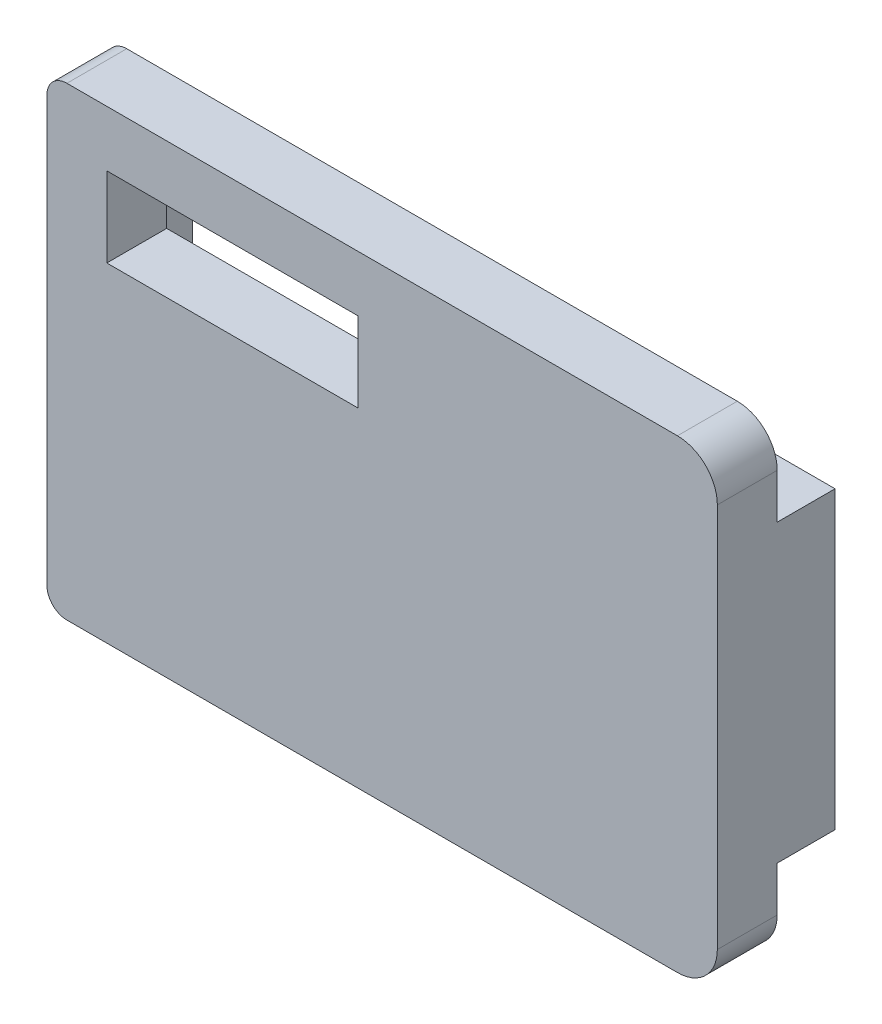
ISO-10303-21;
HEADER;
FILE_DESCRIPTION(('STEP AP214'),'2;1');
FILE_NAME('part.step','',(''),(''),'','','');
FILE_SCHEMA(('AUTOMOTIVE_DESIGN { 1 0 10303 214 1 1 1 1 }'));
ENDSEC;
DATA;
#1=APPLICATION_CONTEXT('core data for automotive mechanical design processes');
#2=APPLICATION_PROTOCOL_DEFINITION('international standard','automotive_design',2000,#1);
#3=PRODUCT_CONTEXT('',#1,'mechanical');
#4=PRODUCT('Part','Part','',(#3));
#5=PRODUCT_RELATED_PRODUCT_CATEGORY('part','',(#4));
#6=PRODUCT_DEFINITION_FORMATION('','',#4);
#7=PRODUCT_DEFINITION_CONTEXT('part definition',#1,'design');
#8=PRODUCT_DEFINITION('design','',#6,#7);
#9=PRODUCT_DEFINITION_SHAPE('','',#8);
#10=(LENGTH_UNIT() NAMED_UNIT(*) SI_UNIT(.MILLI.,.METRE.));
#11=(NAMED_UNIT(*) PLANE_ANGLE_UNIT() SI_UNIT($,.RADIAN.));
#12=(NAMED_UNIT(*) SI_UNIT($,.STERADIAN.) SOLID_ANGLE_UNIT());
#13=UNCERTAINTY_MEASURE_WITH_UNIT(LENGTH_MEASURE(1.E-05),#10,'distance_accuracy_value','');
#14=(GEOMETRIC_REPRESENTATION_CONTEXT(3) GLOBAL_UNCERTAINTY_ASSIGNED_CONTEXT((#13)) GLOBAL_UNIT_ASSIGNED_CONTEXT((#10,
#11,#12)) REPRESENTATION_CONTEXT('',''));
#15=CARTESIAN_POINT('',(0.,0.,0.));
#16=DIRECTION('',(0.,0.,1.));
#17=DIRECTION('',(1.,0.,0.));
#18=AXIS2_PLACEMENT_3D('',#15,#16,#17);
#19=CARTESIAN_POINT('',(24.3,0.,0.));
#20=DIRECTION('',(1.,0.,0.));
#21=DIRECTION('',(0.,0.,-1.));
#22=AXIS2_PLACEMENT_3D('',#19,#20,#21);
#23=PLANE('',#22);
#24=DIRECTION('',(0.,0.,-1.));
#25=VECTOR('',#24,1.);
#26=CARTESIAN_POINT('',(24.3,2.,-4.5));
#27=LINE('',#26,#25);
#28=CARTESIAN_POINT('',(24.3,2.,14.5));
#29=VERTEX_POINT('',#28);
#30=CARTESIAN_POINT('',(24.3,2.,11.5));
#31=VERTEX_POINT('',#30);
#32=EDGE_CURVE('E421',#29,#31,#27,.T.);
#33=ORIENTED_EDGE('',*,*,#32,.T.);
#34=DIRECTION('',(0.,1.,0.));
#35=VECTOR('',#34,1.);
#36=CARTESIAN_POINT('',(24.3,0.,11.5));
#37=LINE('',#36,#35);
#38=CARTESIAN_POINT('',(24.3,4.25,11.5));
#39=VERTEX_POINT('',#38);
#40=EDGE_CURVE('E344',#31,#39,#37,.T.);
#41=ORIENTED_EDGE('',*,*,#40,.T.);
#42=DIRECTION('',(0.,0.,1.));
#43=VECTOR('',#42,1.);
#44=CARTESIAN_POINT('',(24.3,4.25,8.6));
#45=LINE('',#44,#43);
#46=CARTESIAN_POINT('',(24.3,4.25,8.6));
#47=VERTEX_POINT('',#46);
#48=EDGE_CURVE('E324',#47,#39,#45,.T.);
#49=ORIENTED_EDGE('',*,*,#48,.F.);
#50=DIRECTION('',(0.,-1.,0.));
#51=VECTOR('',#50,1.);
#52=CARTESIAN_POINT('',(24.3,0.,8.6));
#53=LINE('',#52,#51);
#54=CARTESIAN_POINT('',(24.3,19.05,8.6));
#55=VERTEX_POINT('',#54);
#56=EDGE_CURVE('E322',#55,#47,#53,.T.);
#57=ORIENTED_EDGE('',*,*,#56,.F.);
#58=DIRECTION('',(0.,0.,1.));
#59=VECTOR('',#58,1.);
#60=CARTESIAN_POINT('',(24.3,19.05,8.6));
#61=LINE('',#60,#59);
#62=CARTESIAN_POINT('',(24.3,19.05,11.5));
#63=VERTEX_POINT('',#62);
#64=EDGE_CURVE('E331',#55,#63,#61,.T.);
#65=ORIENTED_EDGE('',*,*,#64,.T.);
#66=CARTESIAN_POINT('',(24.3,21.3,11.5));
#67=VERTEX_POINT('',#66);
#68=EDGE_CURVE('E343',#63,#67,#37,.T.);
#69=ORIENTED_EDGE('',*,*,#68,.T.);
#70=DIRECTION('',(0.,0.,1.));
#71=VECTOR('',#70,1.);
#72=CARTESIAN_POINT('',(24.3,21.3,0.));
#73=LINE('',#72,#71);
#74=CARTESIAN_POINT('',(24.3,21.3,14.5));
#75=VERTEX_POINT('',#74);
#76=EDGE_CURVE('E424',#67,#75,#73,.T.);
#77=ORIENTED_EDGE('',*,*,#76,.T.);
#78=DIRECTION('',(0.,-1.,0.));
#79=VECTOR('',#78,1.);
#80=CARTESIAN_POINT('',(24.3,23.3,14.5));
#81=LINE('',#80,#79);
#82=EDGE_CURVE('E360',#75,#29,#81,.T.);
#83=ORIENTED_EDGE('',*,*,#82,.T.);
#84=EDGE_LOOP('',(#33,#41,#49,#57,#65,#69,#77,#83));
#85=FACE_BOUND('',#84,.T.);
#86=ADVANCED_FACE('F138',(#85),#23,.T.);
#87=CARTESIAN_POINT('',(0.,23.3,0.));
#88=DIRECTION('',(0.,1.,0.));
#89=DIRECTION('',(0.,0.,1.));
#90=AXIS2_PLACEMENT_3D('',#87,#88,#89);
#91=PLANE('',#90);
#92=DIRECTION('',(0.,0.,1.));
#93=VECTOR('',#92,1.);
#94=CARTESIAN_POINT('',(22.3,23.3,0.));
#95=LINE('',#94,#93);
#96=CARTESIAN_POINT('',(22.3,23.3,14.5));
#97=VERTEX_POINT('',#96);
#98=CARTESIAN_POINT('',(22.3,23.3,11.5));
#99=VERTEX_POINT('',#98);
#100=EDGE_CURVE('E416',#97,#99,#95,.F.);
#101=ORIENTED_EDGE('',*,*,#100,.T.);
#102=DIRECTION('',(1.,0.,0.));
#103=VECTOR('',#102,1.);
#104=CARTESIAN_POINT('',(-6.3,23.3,11.5));
#105=LINE('',#104,#103);
#106=CARTESIAN_POINT('',(-8.3,23.3,11.5));
#107=VERTEX_POINT('',#106);
#108=EDGE_CURVE('E384',#107,#99,#105,.T.);
#109=ORIENTED_EDGE('',*,*,#108,.F.);
#110=DIRECTION('',(0.,0.,1.));
#111=VECTOR('',#110,1.);
#112=CARTESIAN_POINT('',(-8.3,23.3,14.5));
#113=LINE('',#112,#111);
#114=CARTESIAN_POINT('',(-8.3,23.3,14.5));
#115=VERTEX_POINT('',#114);
#116=EDGE_CURVE('E402',#107,#115,#113,.T.);
#117=ORIENTED_EDGE('',*,*,#116,.T.);
#118=DIRECTION('',(1.,0.,0.));
#119=VECTOR('',#118,1.);
#120=CARTESIAN_POINT('',(0.,23.3,14.5));
#121=LINE('',#120,#119);
#122=EDGE_CURVE('E388',#115,#97,#121,.T.);
#123=ORIENTED_EDGE('',*,*,#122,.T.);
#124=EDGE_LOOP('',(#101,#109,#117,#123));
#125=FACE_BOUND('',#124,.T.);
#126=ADVANCED_FACE('F436',(#125),#91,.T.);
#127=CARTESIAN_POINT('',(0.,0.,0.));
#128=DIRECTION('',(0.,1.,0.));
#129=DIRECTION('',(0.,0.,1.));
#130=AXIS2_PLACEMENT_3D('',#127,#128,#129);
#131=PLANE('',#130);
#132=DIRECTION('',(1.,0.,0.));
#133=VECTOR('',#132,1.);
#134=CARTESIAN_POINT('',(-6.3,0.,11.5));
#135=LINE('',#134,#133);
#136=CARTESIAN_POINT('',(-8.3,0.,11.5));
#137=VERTEX_POINT('',#136);
#138=CARTESIAN_POINT('',(22.3,0.,11.5));
#139=VERTEX_POINT('',#138);
#140=EDGE_CURVE('E377',#137,#139,#135,.T.);
#141=ORIENTED_EDGE('',*,*,#140,.T.);
#142=DIRECTION('',(0.,0.,-1.));
#143=VECTOR('',#142,1.);
#144=CARTESIAN_POINT('',(22.3,0.,14.5));
#145=LINE('',#144,#143);
#146=CARTESIAN_POINT('',(22.3,0.,14.5));
#147=VERTEX_POINT('',#146);
#148=EDGE_CURVE('E419',#139,#147,#145,.F.);
#149=ORIENTED_EDGE('',*,*,#148,.T.);
#150=DIRECTION('',(1.,0.,0.));
#151=VECTOR('',#150,1.);
#152=CARTESIAN_POINT('',(0.,0.,14.5));
#153=LINE('',#152,#151);
#154=CARTESIAN_POINT('',(-8.3,0.,14.5));
#155=VERTEX_POINT('',#154);
#156=EDGE_CURVE('E386',#155,#147,#153,.T.);
#157=ORIENTED_EDGE('',*,*,#156,.F.);
#158=DIRECTION('',(0.,0.,1.));
#159=VECTOR('',#158,1.);
#160=CARTESIAN_POINT('',(-8.3,0.,0.));
#161=LINE('',#160,#159);
#162=EDGE_CURVE('E413',#155,#137,#161,.F.);
#163=ORIENTED_EDGE('',*,*,#162,.T.);
#164=EDGE_LOOP('',(#141,#149,#157,#163));
#165=FACE_BOUND('',#164,.T.);
#166=ADVANCED_FACE('F460',(#165),#131,.F.);
#167=CARTESIAN_POINT('',(-9.3,23.3,0.));
#168=DIRECTION('',(1.,0.,0.));
#169=DIRECTION('',(0.,0.,-1.));
#170=AXIS2_PLACEMENT_3D('',#167,#168,#169);
#171=PLANE('',#170);
#172=DIRECTION('',(0.,-1.,0.));
#173=VECTOR('',#172,1.);
#174=CARTESIAN_POINT('',(-9.3,74.354,11.5));
#175=LINE('',#174,#173);
#176=CARTESIAN_POINT('',(-9.3,22.3,11.5));
#177=VERTEX_POINT('',#176);
#178=CARTESIAN_POINT('',(-9.3,16.55,11.5));
#179=VERTEX_POINT('',#178);
#180=EDGE_CURVE('E340',#177,#179,#175,.T.);
#181=ORIENTED_EDGE('',*,*,#180,.T.);
#182=DIRECTION('',(0.,0.,1.));
#183=VECTOR('',#182,1.);
#184=CARTESIAN_POINT('',(-9.3,16.55,8.6));
#185=LINE('',#184,#183);
#186=CARTESIAN_POINT('',(-9.3,16.55,8.6));
#187=VERTEX_POINT('',#186);
#188=EDGE_CURVE('E153',#187,#179,#185,.T.);
#189=ORIENTED_EDGE('',*,*,#188,.F.);
#190=DIRECTION('',(0.,1.,0.));
#191=VECTOR('',#190,1.);
#192=CARTESIAN_POINT('',(-9.3,0.,8.6));
#193=LINE('',#192,#191);
#194=CARTESIAN_POINT('',(-9.3,6.75,8.6));
#195=VERTEX_POINT('',#194);
#196=EDGE_CURVE('E300',#195,#187,#193,.T.);
#197=ORIENTED_EDGE('',*,*,#196,.F.);
#198=DIRECTION('',(0.,0.,1.));
#199=VECTOR('',#198,1.);
#200=CARTESIAN_POINT('',(-9.3,6.75,8.6));
#201=LINE('',#200,#199);
#202=CARTESIAN_POINT('',(-9.3,6.75,11.5));
#203=VERTEX_POINT('',#202);
#204=EDGE_CURVE('E288',#195,#203,#201,.T.);
#205=ORIENTED_EDGE('',*,*,#204,.T.);
#206=CARTESIAN_POINT('',(-9.3,1.,11.5));
#207=VERTEX_POINT('',#206);
#208=EDGE_CURVE('E339',#203,#207,#175,.T.);
#209=ORIENTED_EDGE('',*,*,#208,.T.);
#210=DIRECTION('',(0.,0.,1.));
#211=VECTOR('',#210,1.);
#212=CARTESIAN_POINT('',(-9.3,1.,0.));
#213=LINE('',#212,#211);
#214=CARTESIAN_POINT('',(-9.3,1.,14.5));
#215=VERTEX_POINT('',#214);
#216=EDGE_CURVE('E408',#207,#215,#213,.T.);
#217=ORIENTED_EDGE('',*,*,#216,.T.);
#218=DIRECTION('',(0.,-1.,0.));
#219=VECTOR('',#218,1.);
#220=CARTESIAN_POINT('',(-9.3,23.3,14.5));
#221=LINE('',#220,#219);
#222=CARTESIAN_POINT('',(-9.3,22.3,14.5));
#223=VERTEX_POINT('',#222);
#224=EDGE_CURVE('E391',#223,#215,#221,.T.);
#225=ORIENTED_EDGE('',*,*,#224,.F.);
#226=DIRECTION('',(0.,0.,1.));
#227=VECTOR('',#226,1.);
#228=CARTESIAN_POINT('',(-9.3,22.3,-14.5));
#229=LINE('',#228,#227);
#230=EDGE_CURVE('E410',#223,#177,#229,.F.);
#231=ORIENTED_EDGE('',*,*,#230,.T.);
#232=EDGE_LOOP('',(#181,#189,#197,#205,#209,#217,#225,#231));
#233=FACE_BOUND('',#232,.T.);
#234=ADVANCED_FACE('F449',(#233),#171,.F.);
#235=CARTESIAN_POINT('',(6.3,23.3,11.5));
#236=DIRECTION('',(-1.,0.,0.));
#237=DIRECTION('',(0.,0.,1.));
#238=AXIS2_PLACEMENT_3D('',#235,#236,#237);
#239=PLANE('',#238);
#240=DIRECTION('',(0.,0.,1.));
#241=VECTOR('',#240,1.);
#242=CARTESIAN_POINT('',(6.29999999999999,20.5,-14.5));
#243=LINE('',#242,#241);
#244=CARTESIAN_POINT('',(6.3,20.5,11.5));
#245=VERTEX_POINT('',#244);
#246=CARTESIAN_POINT('',(6.29999999999999,20.5,14.5));
#247=VERTEX_POINT('',#246);
#248=EDGE_CURVE('E374',#245,#247,#243,.T.);
#249=ORIENTED_EDGE('',*,*,#248,.F.);
#250=DIRECTION('',(0.,-1.,0.));
#251=VECTOR('',#250,1.);
#252=CARTESIAN_POINT('',(6.3,23.3,11.5));
#253=LINE('',#252,#251);
#254=CARTESIAN_POINT('',(6.3,16.5,11.5));
#255=VERTEX_POINT('',#254);
#256=EDGE_CURVE('E350',#245,#255,#253,.T.);
#257=ORIENTED_EDGE('',*,*,#256,.T.);
#258=DIRECTION('',(0.,0.,1.));
#259=VECTOR('',#258,1.);
#260=CARTESIAN_POINT('',(6.29999999999999,16.5,-14.5));
#261=LINE('',#260,#259);
#262=CARTESIAN_POINT('',(6.29999999999999,16.5,14.5));
#263=VERTEX_POINT('',#262);
#264=EDGE_CURVE('E375',#255,#263,#261,.T.);
#265=ORIENTED_EDGE('',*,*,#264,.T.);
#266=DIRECTION('',(0.,1.,0.));
#267=VECTOR('',#266,1.);
#268=CARTESIAN_POINT('',(6.29999999999999,16.5,14.5));
#269=LINE('',#268,#267);
#270=EDGE_CURVE('E363',#263,#247,#269,.T.);
#271=ORIENTED_EDGE('',*,*,#270,.T.);
#272=EDGE_LOOP('',(#249,#257,#265,#271));
#273=FACE_BOUND('',#272,.T.);
#274=ADVANCED_FACE('F511',(#273),#239,.T.);
#275=CARTESIAN_POINT('',(-6.3,23.3,11.5));
#276=DIRECTION('',(1.,0.,0.));
#277=DIRECTION('',(0.,0.,-1.));
#278=AXIS2_PLACEMENT_3D('',#275,#276,#277);
#279=PLANE('',#278);
#280=DIRECTION('',(0.,0.,1.));
#281=VECTOR('',#280,1.);
#282=CARTESIAN_POINT('',(-6.30000000000001,16.5,-14.5));
#283=LINE('',#282,#281);
#284=CARTESIAN_POINT('',(-6.3,16.5,11.5));
#285=VERTEX_POINT('',#284);
#286=CARTESIAN_POINT('',(-6.30000000000001,16.5,14.5));
#287=VERTEX_POINT('',#286);
#288=EDGE_CURVE('E378',#285,#287,#283,.T.);
#289=ORIENTED_EDGE('',*,*,#288,.F.);
#290=DIRECTION('',(0.,1.,0.));
#291=VECTOR('',#290,1.);
#292=CARTESIAN_POINT('',(-6.3,23.3,11.5));
#293=LINE('',#292,#291);
#294=CARTESIAN_POINT('',(-6.3,20.5,11.5));
#295=VERTEX_POINT('',#294);
#296=EDGE_CURVE('E352',#285,#295,#293,.T.);
#297=ORIENTED_EDGE('',*,*,#296,.T.);
#298=DIRECTION('',(0.,0.,1.));
#299=VECTOR('',#298,1.);
#300=CARTESIAN_POINT('',(-6.30000000000001,20.5,-14.5));
#301=LINE('',#300,#299);
#302=CARTESIAN_POINT('',(-6.30000000000001,20.5,14.5));
#303=VERTEX_POINT('',#302);
#304=EDGE_CURVE('E380',#295,#303,#301,.T.);
#305=ORIENTED_EDGE('',*,*,#304,.T.);
#306=DIRECTION('',(0.,-1.,0.));
#307=VECTOR('',#306,1.);
#308=CARTESIAN_POINT('',(-6.30000000000001,16.5,14.5));
#309=LINE('',#308,#307);
#310=EDGE_CURVE('E368',#303,#287,#309,.T.);
#311=ORIENTED_EDGE('',*,*,#310,.T.);
#312=EDGE_LOOP('',(#289,#297,#305,#311));
#313=FACE_BOUND('',#312,.T.);
#314=ADVANCED_FACE('F508',(#313),#279,.T.);
#315=CARTESIAN_POINT('',(-8.3,22.3,0.));
#316=DIRECTION('',(0.,0.,-1.));
#317=DIRECTION('',(-1.,0.,0.));
#318=AXIS2_PLACEMENT_3D('',#315,#316,#317);
#319=CYLINDRICAL_SURFACE('',#318,1.);
#320=ORIENTED_EDGE('',*,*,#116,.F.);
#321=CARTESIAN_POINT('',(-8.3,22.3,11.5));
#322=DIRECTION('',(0.,0.,-1.));
#323=DIRECTION('',(-1.,0.,0.));
#324=AXIS2_PLACEMENT_3D('',#321,#322,#323);
#325=CIRCLE('',#324,1.);
#326=EDGE_CURVE('E357',#107,#177,#325,.F.);
#327=ORIENTED_EDGE('',*,*,#326,.T.);
#328=ORIENTED_EDGE('',*,*,#230,.F.);
#329=CARTESIAN_POINT('',(-8.3,22.3,14.5));
#330=DIRECTION('',(0.,0.,-1.));
#331=DIRECTION('',(-1.,0.,0.));
#332=AXIS2_PLACEMENT_3D('',#329,#330,#331);
#333=CIRCLE('',#332,1.);
#334=EDGE_CURVE('E406',#115,#223,#333,.F.);
#335=ORIENTED_EDGE('',*,*,#334,.F.);
#336=EDGE_LOOP('',(#320,#327,#328,#335));
#337=FACE_BOUND('',#336,.T.);
#338=ADVANCED_FACE('F446',(#337),#319,.T.);
#339=CARTESIAN_POINT('',(-8.3,1.,0.));
#340=DIRECTION('',(0.,0.,1.));
#341=DIRECTION('',(1.,0.,0.));
#342=AXIS2_PLACEMENT_3D('',#339,#340,#341);
#343=CYLINDRICAL_SURFACE('',#342,1.);
#344=ORIENTED_EDGE('',*,*,#216,.F.);
#345=CARTESIAN_POINT('',(-8.3,1.,11.5));
#346=DIRECTION('',(0.,0.,-1.));
#347=DIRECTION('',(-1.,0.,0.));
#348=AXIS2_PLACEMENT_3D('',#345,#346,#347);
#349=CIRCLE('',#348,1.);
#350=EDGE_CURVE('E354',#207,#137,#349,.F.);
#351=ORIENTED_EDGE('',*,*,#350,.T.);
#352=ORIENTED_EDGE('',*,*,#162,.F.);
#353=CARTESIAN_POINT('',(-8.3,1.,14.5));
#354=DIRECTION('',(0.,0.,-1.));
#355=DIRECTION('',(-1.,0.,0.));
#356=AXIS2_PLACEMENT_3D('',#353,#354,#355);
#357=CIRCLE('',#356,1.);
#358=EDGE_CURVE('E404',#215,#155,#357,.F.);
#359=ORIENTED_EDGE('',*,*,#358,.F.);
#360=EDGE_LOOP('',(#344,#351,#352,#359));
#361=FACE_BOUND('',#360,.T.);
#362=ADVANCED_FACE('F456',(#361),#343,.T.);
#363=CARTESIAN_POINT('',(22.3,21.3,0.));
#364=DIRECTION('',(0.,0.,1.));
#365=DIRECTION('',(1.,0.,0.));
#366=AXIS2_PLACEMENT_3D('',#363,#364,#365);
#367=CYLINDRICAL_SURFACE('',#366,2.);
#368=ORIENTED_EDGE('',*,*,#76,.F.);
#369=CARTESIAN_POINT('',(22.3,21.3,11.5));
#370=DIRECTION('',(0.,0.,-1.));
#371=DIRECTION('',(-1.,0.,0.));
#372=AXIS2_PLACEMENT_3D('',#369,#370,#371);
#373=CIRCLE('',#372,2.);
#374=EDGE_CURVE('E347',#67,#99,#373,.F.);
#375=ORIENTED_EDGE('',*,*,#374,.T.);
#376=ORIENTED_EDGE('',*,*,#100,.F.);
#377=CARTESIAN_POINT('',(22.3,21.3,14.5));
#378=DIRECTION('',(0.,0.,-1.));
#379=DIRECTION('',(-1.,0.,0.));
#380=AXIS2_PLACEMENT_3D('',#377,#378,#379);
#381=CIRCLE('',#380,2.);
#382=EDGE_CURVE('E146',#75,#97,#381,.F.);
#383=ORIENTED_EDGE('',*,*,#382,.F.);
#384=EDGE_LOOP('',(#368,#375,#376,#383));
#385=FACE_BOUND('',#384,.T.);
#386=ADVANCED_FACE('F439',(#385),#367,.T.);
#387=CARTESIAN_POINT('',(22.3,2.,0.));
#388=DIRECTION('',(0.,0.,1.));
#389=DIRECTION('',(1.,0.,0.));
#390=AXIS2_PLACEMENT_3D('',#387,#388,#389);
#391=CYLINDRICAL_SURFACE('',#390,2.);
#392=ORIENTED_EDGE('',*,*,#148,.F.);
#393=CARTESIAN_POINT('',(22.3,2.,11.5));
#394=DIRECTION('',(0.,0.,-1.));
#395=DIRECTION('',(-1.,0.,0.));
#396=AXIS2_PLACEMENT_3D('',#393,#394,#395);
#397=CIRCLE('',#396,2.);
#398=EDGE_CURVE('E12',#139,#31,#397,.F.);
#399=ORIENTED_EDGE('',*,*,#398,.T.);
#400=ORIENTED_EDGE('',*,*,#32,.F.);
#401=CARTESIAN_POINT('',(22.3,2.,14.5));
#402=DIRECTION('',(0.,0.,-1.));
#403=DIRECTION('',(-1.,0.,0.));
#404=AXIS2_PLACEMENT_3D('',#401,#402,#403);
#405=CIRCLE('',#404,2.);
#406=EDGE_CURVE('E426',#147,#29,#405,.F.);
#407=ORIENTED_EDGE('',*,*,#406,.F.);
#408=EDGE_LOOP('',(#392,#399,#400,#407));
#409=FACE_BOUND('',#408,.T.);
#410=ADVANCED_FACE('F140',(#409),#391,.T.);
#411=CARTESIAN_POINT('',(0.,23.3,14.5));
#412=DIRECTION('',(0.,0.,-1.));
#413=DIRECTION('',(-1.,0.,0.));
#414=AXIS2_PLACEMENT_3D('',#411,#412,#413);
#415=PLANE('',#414);
#416=DIRECTION('',(-1.,0.,0.));
#417=VECTOR('',#416,1.);
#418=CARTESIAN_POINT('',(-6.30000000000001,20.5,14.5));
#419=LINE('',#418,#417);
#420=EDGE_CURVE('E365',#247,#303,#419,.T.);
#421=ORIENTED_EDGE('',*,*,#420,.F.);
#422=ORIENTED_EDGE('',*,*,#270,.F.);
#423=DIRECTION('',(1.,0.,0.));
#424=VECTOR('',#423,1.);
#425=CARTESIAN_POINT('',(-6.30000000000001,16.5,14.5));
#426=LINE('',#425,#424);
#427=EDGE_CURVE('E371',#287,#263,#426,.T.);
#428=ORIENTED_EDGE('',*,*,#427,.F.);
#429=ORIENTED_EDGE('',*,*,#310,.F.);
#430=EDGE_LOOP('',(#421,#422,#428,#429));
#431=FACE_BOUND('',#430,.T.);
#432=ORIENTED_EDGE('',*,*,#82,.F.);
#433=ORIENTED_EDGE('',*,*,#382,.T.);
#434=ORIENTED_EDGE('',*,*,#122,.F.);
#435=ORIENTED_EDGE('',*,*,#334,.T.);
#436=ORIENTED_EDGE('',*,*,#224,.T.);
#437=ORIENTED_EDGE('',*,*,#358,.T.);
#438=ORIENTED_EDGE('',*,*,#156,.T.);
#439=ORIENTED_EDGE('',*,*,#406,.T.);
#440=EDGE_LOOP('',(#432,#433,#434,#435,#436,#437,#438,#439));
#441=FACE_BOUND('',#440,.T.);
#442=ADVANCED_FACE('F431',(#431,#441),#415,.F.);
#443=CARTESIAN_POINT('',(-6.3,23.3,11.5));
#444=DIRECTION('',(0.,0.,-1.));
#445=DIRECTION('',(-1.,0.,0.));
#446=AXIS2_PLACEMENT_3D('',#443,#444,#445);
#447=PLANE('',#446);
#448=DIRECTION('',(1.,0.,0.));
#449=VECTOR('',#448,1.);
#450=CARTESIAN_POINT('',(0.,6.75,11.5));
#451=LINE('',#450,#449);
#452=CARTESIAN_POINT('',(-7.9,6.75,11.5));
#453=VERTEX_POINT('',#452);
#454=EDGE_CURVE('E307',#203,#453,#451,.T.);
#455=ORIENTED_EDGE('',*,*,#454,.T.);
#456=DIRECTION('',(0.,1.,0.));
#457=VECTOR('',#456,1.);
#458=CARTESIAN_POINT('',(-7.9,0.,11.5));
#459=LINE('',#458,#457);
#460=CARTESIAN_POINT('',(-7.9,16.55,11.5));
#461=VERTEX_POINT('',#460);
#462=EDGE_CURVE('E282',#453,#461,#459,.T.);
#463=ORIENTED_EDGE('',*,*,#462,.T.);
#464=DIRECTION('',(1.,0.,0.));
#465=VECTOR('',#464,1.);
#466=CARTESIAN_POINT('',(0.,16.55,11.5));
#467=LINE('',#466,#465);
#468=EDGE_CURVE('E296',#179,#461,#467,.T.);
#469=ORIENTED_EDGE('',*,*,#468,.F.);
#470=ORIENTED_EDGE('',*,*,#180,.F.);
#471=ORIENTED_EDGE('',*,*,#326,.F.);
#472=ORIENTED_EDGE('',*,*,#108,.T.);
#473=ORIENTED_EDGE('',*,*,#374,.F.);
#474=ORIENTED_EDGE('',*,*,#68,.F.);
#475=DIRECTION('',(-1.,0.,0.));
#476=VECTOR('',#475,1.);
#477=CARTESIAN_POINT('',(0.,19.05,11.5));
#478=LINE('',#477,#476);
#479=CARTESIAN_POINT('',(19.4,19.05,11.5));
#480=VERTEX_POINT('',#479);
#481=EDGE_CURVE('E317',#63,#480,#478,.T.);
#482=ORIENTED_EDGE('',*,*,#481,.T.);
#483=DIRECTION('',(0.,1.,0.));
#484=VECTOR('',#483,1.);
#485=CARTESIAN_POINT('',(19.4,0.,11.5));
#486=LINE('',#485,#484);
#487=CARTESIAN_POINT('',(19.4,4.25,11.5));
#488=VERTEX_POINT('',#487);
#489=EDGE_CURVE('E161',#488,#480,#486,.T.);
#490=ORIENTED_EDGE('',*,*,#489,.F.);
#491=DIRECTION('',(-1.,0.,0.));
#492=VECTOR('',#491,1.);
#493=CARTESIAN_POINT('',(0.,4.25,11.5));
#494=LINE('',#493,#492);
#495=EDGE_CURVE('E287',#39,#488,#494,.T.);
#496=ORIENTED_EDGE('',*,*,#495,.F.);
#497=ORIENTED_EDGE('',*,*,#40,.F.);
#498=ORIENTED_EDGE('',*,*,#398,.F.);
#499=ORIENTED_EDGE('',*,*,#140,.F.);
#500=ORIENTED_EDGE('',*,*,#350,.F.);
#501=ORIENTED_EDGE('',*,*,#208,.F.);
#502=EDGE_LOOP('',(#455,#463,#469,#470,#471,#472,#473,#474,#482,#490,#496,#497,#498,#499,#500,#501));
#503=FACE_BOUND('',#502,.T.);
#504=ORIENTED_EDGE('',*,*,#256,.F.);
#505=DIRECTION('',(1.,0.,0.));
#506=VECTOR('',#505,1.);
#507=CARTESIAN_POINT('',(-6.3,20.5,11.5));
#508=LINE('',#507,#506);
#509=EDGE_CURVE('E396',#295,#245,#508,.T.);
#510=ORIENTED_EDGE('',*,*,#509,.F.);
#511=ORIENTED_EDGE('',*,*,#296,.F.);
#512=DIRECTION('',(-1.,0.,0.));
#513=VECTOR('',#512,1.);
#514=CARTESIAN_POINT('',(-6.3,16.5,11.5));
#515=LINE('',#514,#513);
#516=EDGE_CURVE('E399',#255,#285,#515,.T.);
#517=ORIENTED_EDGE('',*,*,#516,.F.);
#518=EDGE_LOOP('',(#504,#510,#511,#517));
#519=FACE_BOUND('',#518,.T.);
#520=ADVANCED_FACE('F441',(#503,#519),#447,.T.);
#521=CARTESIAN_POINT('',(-6.30000000000001,20.5,-14.5));
#522=DIRECTION('',(0.,1.,0.));
#523=DIRECTION('',(0.,0.,1.));
#524=AXIS2_PLACEMENT_3D('',#521,#522,#523);
#525=PLANE('',#524);
#526=ORIENTED_EDGE('',*,*,#509,.T.);
#527=ORIENTED_EDGE('',*,*,#248,.T.);
#528=ORIENTED_EDGE('',*,*,#420,.T.);
#529=ORIENTED_EDGE('',*,*,#304,.F.);
#530=EDGE_LOOP('',(#526,#527,#528,#529));
#531=FACE_BOUND('',#530,.T.);
#532=ADVANCED_FACE('F501',(#531),#525,.F.);
#533=CARTESIAN_POINT('',(-6.30000000000001,16.5,-14.5));
#534=DIRECTION('',(0.,-1.,0.));
#535=DIRECTION('',(0.,0.,-1.));
#536=AXIS2_PLACEMENT_3D('',#533,#534,#535);
#537=PLANE('',#536);
#538=ORIENTED_EDGE('',*,*,#516,.T.);
#539=ORIENTED_EDGE('',*,*,#288,.T.);
#540=ORIENTED_EDGE('',*,*,#427,.T.);
#541=ORIENTED_EDGE('',*,*,#264,.F.);
#542=EDGE_LOOP('',(#538,#539,#540,#541));
#543=FACE_BOUND('',#542,.T.);
#544=ADVANCED_FACE('F498',(#543),#537,.F.);
#545=CARTESIAN_POINT('',(0.,4.25,8.6));
#546=DIRECTION('',(0.,1.,0.));
#547=DIRECTION('',(0.,0.,1.));
#548=AXIS2_PLACEMENT_3D('',#545,#546,#547);
#549=PLANE('',#548);
#550=ORIENTED_EDGE('',*,*,#495,.T.);
#551=DIRECTION('',(0.,0.,1.));
#552=VECTOR('',#551,1.);
#553=CARTESIAN_POINT('',(19.4,4.25,8.6));
#554=LINE('',#553,#552);
#555=CARTESIAN_POINT('',(19.4,4.25,8.6));
#556=VERTEX_POINT('',#555);
#557=EDGE_CURVE('E337',#556,#488,#554,.T.);
#558=ORIENTED_EDGE('',*,*,#557,.F.);
#559=DIRECTION('',(-1.,0.,0.));
#560=VECTOR('',#559,1.);
#561=CARTESIAN_POINT('',(0.,4.25,8.6));
#562=LINE('',#561,#560);
#563=EDGE_CURVE('E313',#47,#556,#562,.T.);
#564=ORIENTED_EDGE('',*,*,#563,.F.);
#565=ORIENTED_EDGE('',*,*,#48,.T.);
#566=EDGE_LOOP('',(#550,#558,#564,#565));
#567=FACE_BOUND('',#566,.T.);
#568=ADVANCED_FACE('F478',(#567),#549,.F.);
#569=CARTESIAN_POINT('',(19.4,0.,8.6));
#570=DIRECTION('',(1.,0.,0.));
#571=DIRECTION('',(0.,0.,-1.));
#572=AXIS2_PLACEMENT_3D('',#569,#570,#571);
#573=PLANE('',#572);
#574=ORIENTED_EDGE('',*,*,#489,.T.);
#575=DIRECTION('',(0.,0.,1.));
#576=VECTOR('',#575,1.);
#577=CARTESIAN_POINT('',(19.4,19.05,8.6));
#578=LINE('',#577,#576);
#579=CARTESIAN_POINT('',(19.4,19.05,8.6));
#580=VERTEX_POINT('',#579);
#581=EDGE_CURVE('E334',#580,#480,#578,.T.);
#582=ORIENTED_EDGE('',*,*,#581,.F.);
#583=DIRECTION('',(0.,1.,0.));
#584=VECTOR('',#583,1.);
#585=CARTESIAN_POINT('',(19.4,0.,8.6));
#586=LINE('',#585,#584);
#587=EDGE_CURVE('E316',#556,#580,#586,.T.);
#588=ORIENTED_EDGE('',*,*,#587,.F.);
#589=ORIENTED_EDGE('',*,*,#557,.T.);
#590=EDGE_LOOP('',(#574,#582,#588,#589));
#591=FACE_BOUND('',#590,.T.);
#592=ADVANCED_FACE('F474',(#591),#573,.F.);
#593=CARTESIAN_POINT('',(0.,19.05,8.6));
#594=DIRECTION('',(0.,1.,0.));
#595=DIRECTION('',(0.,0.,1.));
#596=AXIS2_PLACEMENT_3D('',#593,#594,#595);
#597=PLANE('',#596);
#598=ORIENTED_EDGE('',*,*,#481,.F.);
#599=ORIENTED_EDGE('',*,*,#64,.F.);
#600=DIRECTION('',(-1.,0.,0.));
#601=VECTOR('',#600,1.);
#602=CARTESIAN_POINT('',(0.,19.05,8.6));
#603=LINE('',#602,#601);
#604=EDGE_CURVE('E319',#55,#580,#603,.T.);
#605=ORIENTED_EDGE('',*,*,#604,.T.);
#606=ORIENTED_EDGE('',*,*,#581,.T.);
#607=EDGE_LOOP('',(#598,#599,#605,#606));
#608=FACE_BOUND('',#607,.T.);
#609=ADVANCED_FACE('F471',(#608),#597,.T.);
#610=CARTESIAN_POINT('',(0.,0.,8.6));
#611=DIRECTION('',(0.,0.,-1.));
#612=DIRECTION('',(-1.,0.,0.));
#613=AXIS2_PLACEMENT_3D('',#610,#611,#612);
#614=PLANE('',#613);
#615=ORIENTED_EDGE('',*,*,#563,.T.);
#616=ORIENTED_EDGE('',*,*,#587,.T.);
#617=ORIENTED_EDGE('',*,*,#604,.F.);
#618=ORIENTED_EDGE('',*,*,#56,.T.);
#619=EDGE_LOOP('',(#615,#616,#617,#618));
#620=FACE_BOUND('',#619,.T.);
#621=ADVANCED_FACE('F480',(#620),#614,.T.);
#622=CARTESIAN_POINT('',(-7.9,0.,8.6));
#623=DIRECTION('',(1.,0.,0.));
#624=DIRECTION('',(0.,0.,-1.));
#625=AXIS2_PLACEMENT_3D('',#622,#623,#624);
#626=PLANE('',#625);
#627=ORIENTED_EDGE('',*,*,#462,.F.);
#628=DIRECTION('',(0.,0.,1.));
#629=VECTOR('',#628,1.);
#630=CARTESIAN_POINT('',(-7.9,6.75,8.6));
#631=LINE('',#630,#629);
#632=CARTESIAN_POINT('',(-7.9,6.75,8.6));
#633=VERTEX_POINT('',#632);
#634=EDGE_CURVE('E277',#633,#453,#631,.T.);
#635=ORIENTED_EDGE('',*,*,#634,.F.);
#636=DIRECTION('',(0.,1.,0.));
#637=VECTOR('',#636,1.);
#638=CARTESIAN_POINT('',(-7.9,0.,8.6));
#639=LINE('',#638,#637);
#640=CARTESIAN_POINT('',(-7.9,16.55,8.6));
#641=VERTEX_POINT('',#640);
#642=EDGE_CURVE('E280',#633,#641,#639,.T.);
#643=ORIENTED_EDGE('',*,*,#642,.T.);
#644=DIRECTION('',(0.,0.,1.));
#645=VECTOR('',#644,1.);
#646=CARTESIAN_POINT('',(-7.9,16.55,8.6));
#647=LINE('',#646,#645);
#648=EDGE_CURVE('E305',#641,#461,#647,.T.);
#649=ORIENTED_EDGE('',*,*,#648,.T.);
#650=EDGE_LOOP('',(#627,#635,#643,#649));
#651=FACE_BOUND('',#650,.T.);
#652=ADVANCED_FACE('F279',(#651),#626,.T.);
#653=CARTESIAN_POINT('',(0.,6.75,8.6));
#654=DIRECTION('',(0.,-1.,0.));
#655=DIRECTION('',(0.,0.,-1.));
#656=AXIS2_PLACEMENT_3D('',#653,#654,#655);
#657=PLANE('',#656);
#658=ORIENTED_EDGE('',*,*,#454,.F.);
#659=ORIENTED_EDGE('',*,*,#204,.F.);
#660=DIRECTION('',(1.,0.,0.));
#661=VECTOR('',#660,1.);
#662=CARTESIAN_POINT('',(0.,6.75,8.6));
#663=LINE('',#662,#661);
#664=EDGE_CURVE('E293',#195,#633,#663,.T.);
#665=ORIENTED_EDGE('',*,*,#664,.T.);
#666=ORIENTED_EDGE('',*,*,#634,.T.);
#667=EDGE_LOOP('',(#658,#659,#665,#666));
#668=FACE_BOUND('',#667,.T.);
#669=ADVANCED_FACE('F298',(#668),#657,.T.);
#670=CARTESIAN_POINT('',(0.,16.55,8.6));
#671=DIRECTION('',(0.,-1.,0.));
#672=DIRECTION('',(0.,0.,-1.));
#673=AXIS2_PLACEMENT_3D('',#670,#671,#672);
#674=PLANE('',#673);
#675=ORIENTED_EDGE('',*,*,#468,.T.);
#676=ORIENTED_EDGE('',*,*,#648,.F.);
#677=DIRECTION('',(1.,0.,0.));
#678=VECTOR('',#677,1.);
#679=CARTESIAN_POINT('',(0.,16.55,8.6));
#680=LINE('',#679,#678);
#681=EDGE_CURVE('E294',#187,#641,#680,.T.);
#682=ORIENTED_EDGE('',*,*,#681,.F.);
#683=ORIENTED_EDGE('',*,*,#188,.T.);
#684=EDGE_LOOP('',(#675,#676,#682,#683));
#685=FACE_BOUND('',#684,.T.);
#686=ADVANCED_FACE('F583',(#685),#674,.F.);
#687=CARTESIAN_POINT('',(0.,0.,8.6));
#688=DIRECTION('',(0.,0.,-1.));
#689=DIRECTION('',(-1.,0.,0.));
#690=AXIS2_PLACEMENT_3D('',#687,#688,#689);
#691=PLANE('',#690);
#692=ORIENTED_EDGE('',*,*,#642,.F.);
#693=ORIENTED_EDGE('',*,*,#664,.F.);
#694=ORIENTED_EDGE('',*,*,#196,.T.);
#695=ORIENTED_EDGE('',*,*,#681,.T.);
#696=EDGE_LOOP('',(#692,#693,#694,#695));
#697=FACE_BOUND('',#696,.T.);
#698=ADVANCED_FACE('F292',(#697),#691,.T.);
#699=CLOSED_SHELL('',(#86,#126,#166,#234,#274,#314,#338,#362,#386,#410,#442,#520,#532,#544,#568,
#592,#609,#621,#652,#669,#686,#698));
#700=MANIFOLD_SOLID_BREP('B2',#699);
#701=ADVANCED_BREP_SHAPE_REPRESENTATION('',(#18,#700),#14);
#702=SHAPE_DEFINITION_REPRESENTATION(#9,#701);
ENDSEC;
END-ISO-10303-21;
